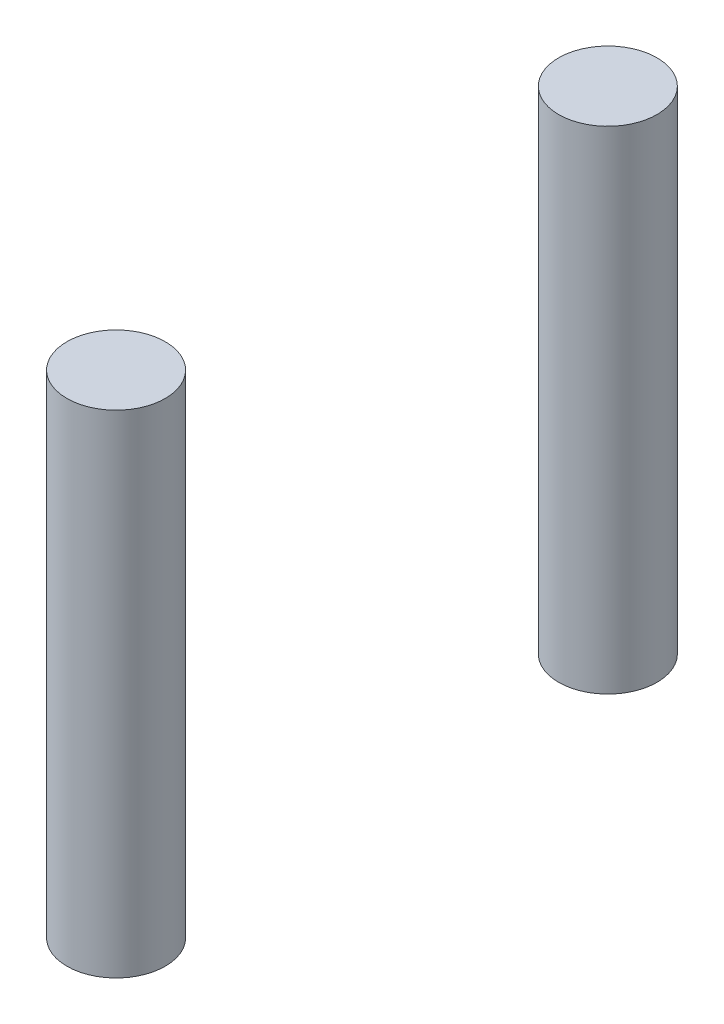
ISO-10303-21;
HEADER;
FILE_DESCRIPTION(('STEP AP214'),'2;1');
FILE_NAME('part.step','',(''),(''),'','','');
FILE_SCHEMA(('AUTOMOTIVE_DESIGN { 1 0 10303 214 1 1 1 1 }'));
ENDSEC;
DATA;
#1=APPLICATION_CONTEXT('core data for automotive mechanical design processes');
#2=APPLICATION_PROTOCOL_DEFINITION('international standard','automotive_design',2000,#1);
#3=PRODUCT_CONTEXT('',#1,'mechanical');
#4=PRODUCT('Part','Part','',(#3));
#5=PRODUCT_RELATED_PRODUCT_CATEGORY('part','',(#4));
#6=PRODUCT_DEFINITION_FORMATION('','',#4);
#7=PRODUCT_DEFINITION_CONTEXT('part definition',#1,'design');
#8=PRODUCT_DEFINITION('design','',#6,#7);
#9=PRODUCT_DEFINITION_SHAPE('','',#8);
#10=(LENGTH_UNIT() NAMED_UNIT(*) SI_UNIT(.MILLI.,.METRE.));
#11=(NAMED_UNIT(*) PLANE_ANGLE_UNIT() SI_UNIT($,.RADIAN.));
#12=(NAMED_UNIT(*) SI_UNIT($,.STERADIAN.) SOLID_ANGLE_UNIT());
#13=UNCERTAINTY_MEASURE_WITH_UNIT(LENGTH_MEASURE(1.E-05),#10,'distance_accuracy_value','');
#14=(GEOMETRIC_REPRESENTATION_CONTEXT(3) GLOBAL_UNCERTAINTY_ASSIGNED_CONTEXT((#13)) GLOBAL_UNIT_ASSIGNED_CONTEXT((#10,
#11,#12)) REPRESENTATION_CONTEXT('',''));
#15=CARTESIAN_POINT('',(0.,0.,0.));
#16=DIRECTION('',(0.,0.,1.));
#17=DIRECTION('',(1.,0.,0.));
#18=AXIS2_PLACEMENT_3D('',#15,#16,#17);
#19=CARTESIAN_POINT('',(0.,-13.,-5.));
#20=DIRECTION('',(0.,1.,0.));
#21=DIRECTION('',(0.,0.,1.));
#22=AXIS2_PLACEMENT_3D('',#19,#20,#21);
#23=CYLINDRICAL_SURFACE('',#22,1.);
#24=CARTESIAN_POINT('',(0.,-13.,-5.));
#25=DIRECTION('',(0.,1.,0.));
#26=DIRECTION('',(0.,0.,1.));
#27=AXIS2_PLACEMENT_3D('',#24,#25,#26);
#28=CIRCLE('',#27,1.);
#29=CARTESIAN_POINT('',(0.,-13.,-4.));
#30=VERTEX_POINT('',#29);
#31=EDGE_CURVE('E11',#30,#30,#28,.T.);
#32=ORIENTED_EDGE('',*,*,#31,.T.);
#33=EDGE_LOOP('',(#32));
#34=FACE_BOUND('',#33,.T.);
#35=CARTESIAN_POINT('',(0.,-3.,-5.));
#36=DIRECTION('',(0.,1.,0.));
#37=DIRECTION('',(0.,0.,1.));
#38=AXIS2_PLACEMENT_3D('',#35,#36,#37);
#39=CIRCLE('',#38,1.);
#40=CARTESIAN_POINT('',(0.,-3.,-4.));
#41=VERTEX_POINT('',#40);
#42=EDGE_CURVE('E44',#41,#41,#39,.T.);
#43=ORIENTED_EDGE('',*,*,#42,.F.);
#44=EDGE_LOOP('',(#43));
#45=FACE_BOUND('',#44,.T.);
#46=ADVANCED_FACE('F41',(#34,#45),#23,.T.);
#47=CARTESIAN_POINT('',(0.,-13.,-5.));
#48=DIRECTION('',(0.,1.,0.));
#49=DIRECTION('',(0.,0.,1.));
#50=AXIS2_PLACEMENT_3D('',#47,#48,#49);
#51=PLANE('',#50);
#52=ORIENTED_EDGE('',*,*,#31,.F.);
#53=EDGE_LOOP('',(#52));
#54=FACE_BOUND('',#53,.T.);
#55=ADVANCED_FACE('F56',(#54),#51,.F.);
#56=CARTESIAN_POINT('',(0.,-3.,-5.));
#57=DIRECTION('',(0.,1.,0.));
#58=DIRECTION('',(0.,0.,1.));
#59=AXIS2_PLACEMENT_3D('',#56,#57,#58);
#60=PLANE('',#59);
#61=ORIENTED_EDGE('',*,*,#42,.T.);
#62=EDGE_LOOP('',(#61));
#63=FACE_BOUND('',#62,.T.);
#64=ADVANCED_FACE('F53',(#63),#60,.T.);
#65=CLOSED_SHELL('',(#46,#55,#64));
#66=MANIFOLD_SOLID_BREP('B2',#65);
#67=CARTESIAN_POINT('',(0.,-13.,5.));
#68=DIRECTION('',(0.,1.,0.));
#69=DIRECTION('',(0.,0.,1.));
#70=AXIS2_PLACEMENT_3D('',#67,#68,#69);
#71=CYLINDRICAL_SURFACE('',#70,1.);
#72=CARTESIAN_POINT('',(0.,-13.,5.));
#73=DIRECTION('',(0.,1.,0.));
#74=DIRECTION('',(0.,0.,1.));
#75=AXIS2_PLACEMENT_3D('',#72,#73,#74);
#76=CIRCLE('',#75,1.);
#77=CARTESIAN_POINT('',(0.,-13.,6.));
#78=VERTEX_POINT('',#77);
#79=EDGE_CURVE('E40',#78,#78,#76,.T.);
#80=ORIENTED_EDGE('',*,*,#79,.T.);
#81=EDGE_LOOP('',(#80));
#82=FACE_BOUND('',#81,.T.);
#83=CARTESIAN_POINT('',(0.,-3.,5.));
#84=DIRECTION('',(0.,1.,0.));
#85=DIRECTION('',(0.,0.,1.));
#86=AXIS2_PLACEMENT_3D('',#83,#84,#85);
#87=CIRCLE('',#86,1.);
#88=CARTESIAN_POINT('',(0.,-3.,6.));
#89=VERTEX_POINT('',#88);
#90=EDGE_CURVE('E85',#89,#89,#87,.T.);
#91=ORIENTED_EDGE('',*,*,#90,.F.);
#92=EDGE_LOOP('',(#91));
#93=FACE_BOUND('',#92,.T.);
#94=ADVANCED_FACE('F82',(#82,#93),#71,.T.);
#95=CARTESIAN_POINT('',(0.,-13.,5.));
#96=DIRECTION('',(0.,1.,0.));
#97=DIRECTION('',(0.,0.,1.));
#98=AXIS2_PLACEMENT_3D('',#95,#96,#97);
#99=PLANE('',#98);
#100=ORIENTED_EDGE('',*,*,#79,.F.);
#101=EDGE_LOOP('',(#100));
#102=FACE_BOUND('',#101,.T.);
#103=ADVANCED_FACE('F97',(#102),#99,.F.);
#104=CARTESIAN_POINT('',(0.,-3.,5.));
#105=DIRECTION('',(0.,1.,0.));
#106=DIRECTION('',(0.,0.,1.));
#107=AXIS2_PLACEMENT_3D('',#104,#105,#106);
#108=PLANE('',#107);
#109=ORIENTED_EDGE('',*,*,#90,.T.);
#110=EDGE_LOOP('',(#109));
#111=FACE_BOUND('',#110,.T.);
#112=ADVANCED_FACE('F94',(#111),#108,.T.);
#113=CLOSED_SHELL('',(#94,#103,#112));
#114=MANIFOLD_SOLID_BREP('B6',#113);
#115=ADVANCED_BREP_SHAPE_REPRESENTATION('',(#18,#66,#114),#14);
#116=SHAPE_DEFINITION_REPRESENTATION(#9,#115);
ENDSEC;
END-ISO-10303-21;
